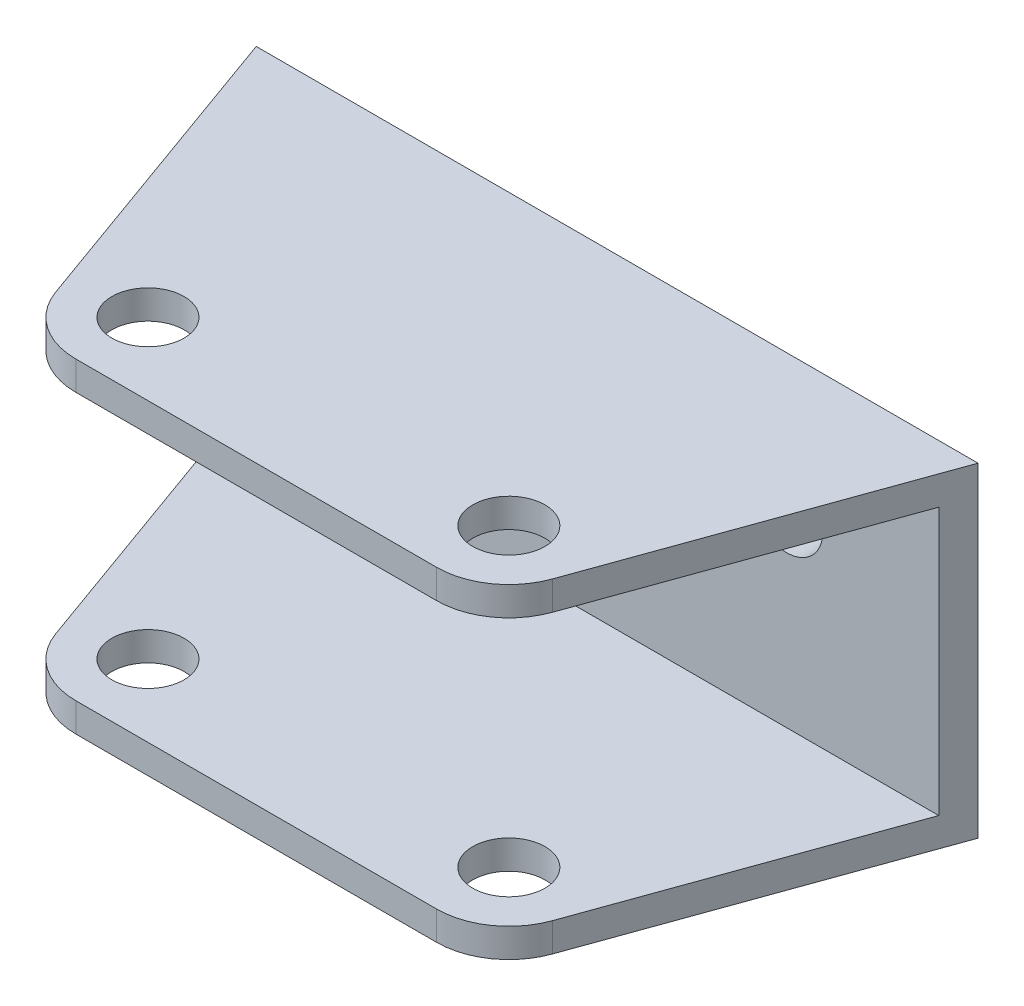
ISO-10303-21;
HEADER;
FILE_DESCRIPTION(('STEP AP214'),'2;1');
FILE_NAME('part.step','',(''),(''),'','','');
FILE_SCHEMA(('AUTOMOTIVE_DESIGN { 1 0 10303 214 1 1 1 1 }'));
ENDSEC;
DATA;
#1=APPLICATION_CONTEXT('core data for automotive mechanical design processes');
#2=APPLICATION_PROTOCOL_DEFINITION('international standard','automotive_design',2000,#1);
#3=PRODUCT_CONTEXT('',#1,'mechanical');
#4=PRODUCT('Part','Part','',(#3));
#5=PRODUCT_RELATED_PRODUCT_CATEGORY('part','',(#4));
#6=PRODUCT_DEFINITION_FORMATION('','',#4);
#7=PRODUCT_DEFINITION_CONTEXT('part definition',#1,'design');
#8=PRODUCT_DEFINITION('design','',#6,#7);
#9=PRODUCT_DEFINITION_SHAPE('','',#8);
#10=(LENGTH_UNIT() NAMED_UNIT(*) SI_UNIT(.MILLI.,.METRE.));
#11=(NAMED_UNIT(*) PLANE_ANGLE_UNIT() SI_UNIT($,.RADIAN.));
#12=(NAMED_UNIT(*) SI_UNIT($,.STERADIAN.) SOLID_ANGLE_UNIT());
#13=UNCERTAINTY_MEASURE_WITH_UNIT(LENGTH_MEASURE(1.E-05),#10,'distance_accuracy_value','');
#14=(GEOMETRIC_REPRESENTATION_CONTEXT(3) GLOBAL_UNCERTAINTY_ASSIGNED_CONTEXT((#13)) GLOBAL_UNIT_ASSIGNED_CONTEXT((#10,
#11,#12)) REPRESENTATION_CONTEXT('',''));
#15=CARTESIAN_POINT('',(0.,0.,0.));
#16=DIRECTION('',(0.,0.,1.));
#17=DIRECTION('',(1.,0.,0.));
#18=AXIS2_PLACEMENT_3D('',#15,#16,#17);
#19=CARTESIAN_POINT('',(0.,0.,82.9));
#20=DIRECTION('',(0.,0.,-1.));
#21=DIRECTION('',(-1.,0.,0.));
#22=AXIS2_PLACEMENT_3D('',#19,#20,#21);
#23=PLANE('',#22);
#24=DIRECTION('',(0.,-1.,0.));
#25=VECTOR('',#24,1.);
#26=CARTESIAN_POINT('',(-35.,-99.29987629617,82.9));
#27=LINE('',#26,#25);
#28=CARTESIAN_POINT('',(-35.,-99.29987629617,82.9));
#29=VERTEX_POINT('',#28);
#30=CARTESIAN_POINT('',(-35.,-103.29987629617,82.9));
#31=VERTEX_POINT('',#30);
#32=EDGE_CURVE('E234',#29,#31,#27,.T.);
#33=ORIENTED_EDGE('',*,*,#32,.T.);
#34=DIRECTION('',(1.,0.,0.));
#35=VECTOR('',#34,1.);
#36=CARTESIAN_POINT('',(0.,-103.29987629617,82.9));
#37=LINE('',#36,#35);
#38=CARTESIAN_POINT('',(15.,-103.29987629617,82.9));
#39=VERTEX_POINT('',#38);
#40=EDGE_CURVE('E196',#31,#39,#37,.T.);
#41=ORIENTED_EDGE('',*,*,#40,.T.);
#42=DIRECTION('',(0.,-1.,0.));
#43=VECTOR('',#42,1.);
#44=CARTESIAN_POINT('',(15.,-99.29987629617,82.9));
#45=LINE('',#44,#43);
#46=CARTESIAN_POINT('',(15.,-99.29987629617,82.9));
#47=VERTEX_POINT('',#46);
#48=EDGE_CURVE('E253',#47,#39,#45,.T.);
#49=ORIENTED_EDGE('',*,*,#48,.F.);
#50=DIRECTION('',(-1.,0.,0.));
#51=VECTOR('',#50,1.);
#52=CARTESIAN_POINT('',(-40.,-99.29987629617,82.9));
#53=LINE('',#52,#51);
#54=EDGE_CURVE('E266',#47,#29,#53,.T.);
#55=ORIENTED_EDGE('',*,*,#54,.T.);
#56=EDGE_LOOP('',(#33,#41,#49,#55));
#57=FACE_BOUND('',#56,.T.);
#58=ADVANCED_FACE('F66',(#57),#23,.F.);
#59=CARTESIAN_POINT('',(15.,-99.29987629617,72.9));
#60=DIRECTION('',(0.,-1.,0.));
#61=DIRECTION('',(0.,0.,-1.));
#62=AXIS2_PLACEMENT_3D('',#59,#60,#61);
#63=CYLINDRICAL_SURFACE('',#62,9.99999999999999);
#64=CARTESIAN_POINT('',(15.,-103.29987629617,72.9));
#65=DIRECTION('',(0.,1.,0.));
#66=DIRECTION('',(0.,0.,1.));
#67=AXIS2_PLACEMENT_3D('',#64,#65,#66);
#68=CIRCLE('',#67,9.99999999999999);
#69=CARTESIAN_POINT('',(24.4108264784655,-103.29987629617,76.281766549041));
#70=VERTEX_POINT('',#69);
#71=EDGE_CURVE('E199',#70,#39,#68,.F.);
#72=ORIENTED_EDGE('',*,*,#71,.F.);
#73=DIRECTION('',(0.,-1.,0.));
#74=VECTOR('',#73,1.);
#75=CARTESIAN_POINT('',(24.4108264784655,-99.29987629617,76.281766549041));
#76=LINE('',#75,#74);
#77=CARTESIAN_POINT('',(24.4108264784655,-99.29987629617,76.281766549041));
#78=VERTEX_POINT('',#77);
#79=EDGE_CURVE('E258',#78,#70,#76,.T.);
#80=ORIENTED_EDGE('',*,*,#79,.F.);
#81=CARTESIAN_POINT('',(15.,-99.29987629617,72.9));
#82=DIRECTION('',(0.,-1.,0.));
#83=DIRECTION('',(0.,0.,-1.));
#84=AXIS2_PLACEMENT_3D('',#81,#82,#83);
#85=CIRCLE('',#84,9.99999999999999);
#86=EDGE_CURVE('E243',#78,#47,#85,.T.);
#87=ORIENTED_EDGE('',*,*,#86,.T.);
#88=ORIENTED_EDGE('',*,*,#48,.T.);
#89=EDGE_LOOP('',(#72,#80,#87,#88));
#90=FACE_BOUND('',#89,.T.);
#91=ADVANCED_FACE('F314',(#90),#63,.T.);
#92=CARTESIAN_POINT('',(15.,-99.29987629617,72.9));
#93=DIRECTION('',(0.,-1.,0.));
#94=DIRECTION('',(0.,0.,-1.));
#95=AXIS2_PLACEMENT_3D('',#92,#93,#94);
#96=CYLINDRICAL_SURFACE('',#95,5.00000000000001);
#97=CARTESIAN_POINT('',(15.,-103.29987629617,72.9));
#98=DIRECTION('',(0.,1.,0.));
#99=DIRECTION('',(0.,0.,1.));
#100=AXIS2_PLACEMENT_3D('',#97,#98,#99);
#101=CIRCLE('',#100,5.00000000000001);
#102=CARTESIAN_POINT('',(15.,-103.29987629617,67.9));
#103=VERTEX_POINT('',#102);
#104=EDGE_CURVE('E205',#103,#103,#101,.F.);
#105=CARTESIAN_POINT('',(15.,-99.29987629617,72.9));
#106=DIRECTION('',(0.,-1.,0.));
#107=DIRECTION('',(0.,0.,-1.));
#108=AXIS2_PLACEMENT_3D('',#105,#106,#107);
#109=CIRCLE('',#108,5.00000000000001);
#110=CARTESIAN_POINT('',(15.,-99.29987629617,67.9));
#111=VERTEX_POINT('',#110);
#112=EDGE_CURVE('E227',#111,#111,#109,.T.);
#113=CARTESIAN_POINT('',(15.,-103.29987629617,67.9));
#114=CARTESIAN_POINT('',(15.,-103.258209629503,67.9));
#115=CARTESIAN_POINT('',(15.,-103.216542962837,67.9));
#116=CARTESIAN_POINT('',(15.,-103.133209629503,67.9));
#117=CARTESIAN_POINT('',(15.,-103.091542962837,67.9));
#118=CARTESIAN_POINT('',(15.,-103.008209629503,67.9));
#119=CARTESIAN_POINT('',(15.,-102.966542962837,67.9));
#120=CARTESIAN_POINT('',(15.,-102.883209629503,67.9));
#121=CARTESIAN_POINT('',(15.,-102.841542962837,67.9));
#122=CARTESIAN_POINT('',(15.,-102.758209629503,67.9));
#123=CARTESIAN_POINT('',(15.,-102.716542962837,67.9));
#124=CARTESIAN_POINT('',(15.,-102.633209629503,67.9));
#125=CARTESIAN_POINT('',(15.,-102.591542962837,67.9));
#126=CARTESIAN_POINT('',(15.,-102.508209629503,67.9));
#127=CARTESIAN_POINT('',(15.,-102.466542962837,67.9));
#128=CARTESIAN_POINT('',(15.,-102.383209629503,67.9));
#129=CARTESIAN_POINT('',(15.,-102.341542962837,67.9));
#130=CARTESIAN_POINT('',(15.,-102.258209629503,67.9));
#131=CARTESIAN_POINT('',(15.,-102.216542962837,67.9));
#132=CARTESIAN_POINT('',(15.,-102.133209629503,67.9));
#133=CARTESIAN_POINT('',(15.,-102.091542962837,67.9));
#134=CARTESIAN_POINT('',(15.,-102.008209629503,67.9));
#135=CARTESIAN_POINT('',(15.,-101.966542962837,67.9));
#136=CARTESIAN_POINT('',(15.,-101.883209629503,67.9));
#137=CARTESIAN_POINT('',(15.,-101.841542962837,67.9));
#138=CARTESIAN_POINT('',(15.,-101.758209629503,67.9));
#139=CARTESIAN_POINT('',(15.,-101.716542962837,67.9));
#140=CARTESIAN_POINT('',(15.,-101.633209629503,67.9));
#141=CARTESIAN_POINT('',(15.,-101.591542962837,67.9));
#142=CARTESIAN_POINT('',(15.,-101.508209629503,67.9));
#143=CARTESIAN_POINT('',(15.,-101.466542962837,67.9));
#144=CARTESIAN_POINT('',(15.,-101.383209629503,67.9));
#145=CARTESIAN_POINT('',(15.,-101.341542962837,67.9));
#146=CARTESIAN_POINT('',(15.,-101.258209629503,67.9));
#147=CARTESIAN_POINT('',(15.,-101.216542962837,67.9));
#148=CARTESIAN_POINT('',(15.,-101.133209629503,67.9));
#149=CARTESIAN_POINT('',(15.,-101.091542962837,67.9));
#150=CARTESIAN_POINT('',(15.,-101.008209629503,67.9));
#151=CARTESIAN_POINT('',(15.,-100.966542962837,67.9));
#152=CARTESIAN_POINT('',(15.,-100.883209629503,67.9));
#153=CARTESIAN_POINT('',(15.,-100.841542962837,67.9));
#154=CARTESIAN_POINT('',(15.,-100.758209629503,67.9));
#155=CARTESIAN_POINT('',(15.,-100.716542962837,67.9));
#156=CARTESIAN_POINT('',(15.,-100.633209629503,67.9));
#157=CARTESIAN_POINT('',(15.,-100.591542962837,67.9));
#158=CARTESIAN_POINT('',(15.,-100.508209629503,67.9));
#159=CARTESIAN_POINT('',(15.,-100.466542962837,67.9));
#160=CARTESIAN_POINT('',(15.,-100.383209629503,67.9));
#161=CARTESIAN_POINT('',(15.,-100.341542962837,67.9));
#162=CARTESIAN_POINT('',(15.,-100.258209629503,67.9));
#163=CARTESIAN_POINT('',(15.,-100.216542962837,67.9));
#164=CARTESIAN_POINT('',(15.,-100.133209629503,67.9));
#165=CARTESIAN_POINT('',(15.,-100.091542962837,67.9));
#166=CARTESIAN_POINT('',(15.,-100.008209629503,67.9));
#167=CARTESIAN_POINT('',(15.,-99.9665429628366,67.9));
#168=CARTESIAN_POINT('',(15.,-99.8832096295033,67.9));
#169=CARTESIAN_POINT('',(15.,-99.8415429628366,67.9));
#170=CARTESIAN_POINT('',(15.,-99.7582096295033,67.9));
#171=CARTESIAN_POINT('',(15.,-99.7165429628366,67.9));
#172=CARTESIAN_POINT('',(15.,-99.6332096295033,67.9));
#173=CARTESIAN_POINT('',(15.,-99.5915429628366,67.9));
#174=CARTESIAN_POINT('',(15.,-99.5082096295033,67.9));
#175=CARTESIAN_POINT('',(15.,-99.4665429628366,67.9));
#176=CARTESIAN_POINT('',(15.,-99.3832096295033,67.9));
#177=CARTESIAN_POINT('',(15.,-99.3415429628366,67.9));
#178=CARTESIAN_POINT('',(15.,-99.29987629617,67.9));
#179=B_SPLINE_CURVE_WITH_KNOTS('',3,(#113,#114,#115,#116,#117,#118,#119,#120,#121,#122,#123,
#124,#125,#126,#127,#128,#129,#130,#131,#132,#133,#134,#135,#136,#137,#138,#139,#140,#141,#142,
#143,#144,#145,#146,#147,#148,#149,#150,#151,#152,#153,#154,#155,#156,#157,#158,#159,#160,#161,
#162,#163,#164,#165,#166,#167,#168,#169,#170,#171,#172,#173,#174,#175,#176,#177,#178),
.UNSPECIFIED.,.F.,.F.,(4,2,2,2,2,2,2,2,2,2,2,2,2,2,2,2,2,2,2,2,2,2,2,2,2,2,2,2,2,2,2,2,4),(0.,
0.125,0.250000000000014,0.375000000000014,0.500000000000014,0.625000000000014,0.750000000000015,
0.875000000000015,1.00000000000001,1.12500000000001,1.25000000000002,1.37500000000002,
1.50000000000002,1.62500000000002,1.75000000000002,1.87500000000002,2.00000000000002,
2.12500000000003,2.25000000000003,2.37500000000003,2.50000000000003,2.62500000000003,
2.75000000000003,2.87500000000003,3.00000000000003,3.12500000000003,3.25000000000003,
3.37500000000003,3.50000000000003,3.62500000000003,3.75000000000003,3.87500000000003,
4.00000000000003),.UNSPECIFIED.);
#180=EDGE_CURVE('BSEAM321',#103,#111,#179,.T.);
#181=ORIENTED_EDGE('',*,*,#104,.T.);
#182=ORIENTED_EDGE('',*,*,#112,.F.);
#183=ORIENTED_EDGE('',*,*,#180,.T.);
#184=ORIENTED_EDGE('',*,*,#180,.F.);
#185=EDGE_LOOP('',(#181,#183,#182,#184));
#186=FACE_BOUND('',#185,.T.);
#187=ADVANCED_FACE('F321',(#186),#96,.F.);
#188=CARTESIAN_POINT('',(-35.,-99.29987629617,72.9));
#189=DIRECTION('',(0.,-1.,0.));
#190=DIRECTION('',(0.,0.,-1.));
#191=AXIS2_PLACEMENT_3D('',#188,#189,#190);
#192=CYLINDRICAL_SURFACE('',#191,5.00000000000001);
#193=CARTESIAN_POINT('',(-35.,-103.29987629617,72.9));
#194=DIRECTION('',(0.,1.,0.));
#195=DIRECTION('',(0.,0.,1.));
#196=AXIS2_PLACEMENT_3D('',#193,#194,#195);
#197=CIRCLE('',#196,5.00000000000001);
#198=CARTESIAN_POINT('',(-35.,-103.29987629617,67.9));
#199=VERTEX_POINT('',#198);
#200=EDGE_CURVE('E202',#199,#199,#197,.F.);
#201=CARTESIAN_POINT('',(-35.,-99.29987629617,72.9));
#202=DIRECTION('',(0.,-1.,0.));
#203=DIRECTION('',(0.,0.,-1.));
#204=AXIS2_PLACEMENT_3D('',#201,#202,#203);
#205=CIRCLE('',#204,5.00000000000001);
#206=CARTESIAN_POINT('',(-35.,-99.29987629617,67.9));
#207=VERTEX_POINT('',#206);
#208=EDGE_CURVE('E210',#207,#207,#205,.T.);
#209=CARTESIAN_POINT('',(-35.,-103.29987629617,67.9));
#210=CARTESIAN_POINT('',(-35.,-103.258209629503,67.9));
#211=CARTESIAN_POINT('',(-35.,-103.216542962837,67.9));
#212=CARTESIAN_POINT('',(-35.,-103.133209629503,67.9));
#213=CARTESIAN_POINT('',(-35.,-103.091542962837,67.9));
#214=CARTESIAN_POINT('',(-35.,-103.008209629503,67.9));
#215=CARTESIAN_POINT('',(-35.,-102.966542962837,67.9));
#216=CARTESIAN_POINT('',(-35.,-102.883209629503,67.9));
#217=CARTESIAN_POINT('',(-35.,-102.841542962837,67.9));
#218=CARTESIAN_POINT('',(-35.,-102.758209629503,67.9));
#219=CARTESIAN_POINT('',(-35.,-102.716542962837,67.9));
#220=CARTESIAN_POINT('',(-35.,-102.633209629503,67.9));
#221=CARTESIAN_POINT('',(-35.,-102.591542962837,67.9));
#222=CARTESIAN_POINT('',(-35.,-102.508209629503,67.9));
#223=CARTESIAN_POINT('',(-35.,-102.466542962837,67.9));
#224=CARTESIAN_POINT('',(-35.,-102.383209629503,67.9));
#225=CARTESIAN_POINT('',(-35.,-102.341542962837,67.9));
#226=CARTESIAN_POINT('',(-35.,-102.258209629503,67.9));
#227=CARTESIAN_POINT('',(-35.,-102.216542962837,67.9));
#228=CARTESIAN_POINT('',(-35.,-102.133209629503,67.9));
#229=CARTESIAN_POINT('',(-35.,-102.091542962837,67.9));
#230=CARTESIAN_POINT('',(-35.,-102.008209629503,67.9));
#231=CARTESIAN_POINT('',(-35.,-101.966542962837,67.9));
#232=CARTESIAN_POINT('',(-35.,-101.883209629503,67.9));
#233=CARTESIAN_POINT('',(-35.,-101.841542962837,67.9));
#234=CARTESIAN_POINT('',(-35.,-101.758209629503,67.9));
#235=CARTESIAN_POINT('',(-35.,-101.716542962837,67.9));
#236=CARTESIAN_POINT('',(-35.,-101.633209629503,67.9));
#237=CARTESIAN_POINT('',(-35.,-101.591542962837,67.9));
#238=CARTESIAN_POINT('',(-35.,-101.508209629503,67.9));
#239=CARTESIAN_POINT('',(-35.,-101.466542962837,67.9));
#240=CARTESIAN_POINT('',(-35.,-101.383209629503,67.9));
#241=CARTESIAN_POINT('',(-35.,-101.341542962837,67.9));
#242=CARTESIAN_POINT('',(-35.,-101.258209629503,67.9));
#243=CARTESIAN_POINT('',(-35.,-101.216542962837,67.9));
#244=CARTESIAN_POINT('',(-35.,-101.133209629503,67.9));
#245=CARTESIAN_POINT('',(-35.,-101.091542962837,67.9));
#246=CARTESIAN_POINT('',(-35.,-101.008209629503,67.9));
#247=CARTESIAN_POINT('',(-35.,-100.966542962837,67.9));
#248=CARTESIAN_POINT('',(-35.,-100.883209629503,67.9));
#249=CARTESIAN_POINT('',(-35.,-100.841542962837,67.9));
#250=CARTESIAN_POINT('',(-35.,-100.758209629503,67.9));
#251=CARTESIAN_POINT('',(-35.,-100.716542962837,67.9));
#252=CARTESIAN_POINT('',(-35.,-100.633209629503,67.9));
#253=CARTESIAN_POINT('',(-35.,-100.591542962837,67.9));
#254=CARTESIAN_POINT('',(-35.,-100.508209629503,67.9));
#255=CARTESIAN_POINT('',(-35.,-100.466542962837,67.9));
#256=CARTESIAN_POINT('',(-35.,-100.383209629503,67.9));
#257=CARTESIAN_POINT('',(-35.,-100.341542962837,67.9));
#258=CARTESIAN_POINT('',(-35.,-100.258209629503,67.9));
#259=CARTESIAN_POINT('',(-35.,-100.216542962837,67.9));
#260=CARTESIAN_POINT('',(-35.,-100.133209629503,67.9));
#261=CARTESIAN_POINT('',(-35.,-100.091542962837,67.9));
#262=CARTESIAN_POINT('',(-35.,-100.008209629503,67.9));
#263=CARTESIAN_POINT('',(-35.,-99.9665429628366,67.9));
#264=CARTESIAN_POINT('',(-35.,-99.8832096295033,67.9));
#265=CARTESIAN_POINT('',(-35.,-99.8415429628366,67.9));
#266=CARTESIAN_POINT('',(-35.,-99.7582096295033,67.9));
#267=CARTESIAN_POINT('',(-35.,-99.7165429628366,67.9));
#268=CARTESIAN_POINT('',(-35.,-99.6332096295033,67.9));
#269=CARTESIAN_POINT('',(-35.,-99.5915429628366,67.9));
#270=CARTESIAN_POINT('',(-35.,-99.5082096295033,67.9));
#271=CARTESIAN_POINT('',(-35.,-99.4665429628366,67.9));
#272=CARTESIAN_POINT('',(-35.,-99.3832096295033,67.9));
#273=CARTESIAN_POINT('',(-35.,-99.3415429628366,67.9));
#274=CARTESIAN_POINT('',(-35.,-99.29987629617,67.9));
#275=B_SPLINE_CURVE_WITH_KNOTS('',3,(#209,#210,#211,#212,#213,#214,#215,#216,#217,#218,#219,
#220,#221,#222,#223,#224,#225,#226,#227,#228,#229,#230,#231,#232,#233,#234,#235,#236,#237,#238,
#239,#240,#241,#242,#243,#244,#245,#246,#247,#248,#249,#250,#251,#252,#253,#254,#255,#256,#257,
#258,#259,#260,#261,#262,#263,#264,#265,#266,#267,#268,#269,#270,#271,#272,#273,#274),
.UNSPECIFIED.,.F.,.F.,(4,2,2,2,2,2,2,2,2,2,2,2,2,2,2,2,2,2,2,2,2,2,2,2,2,2,2,2,2,2,2,2,4),(0.,
0.125,0.250000000000014,0.375000000000014,0.500000000000014,0.625000000000014,0.750000000000015,
0.875000000000015,1.00000000000001,1.12500000000001,1.25000000000002,1.37500000000002,
1.50000000000002,1.62500000000002,1.75000000000002,1.87500000000002,2.00000000000002,
2.12500000000003,2.25000000000003,2.37500000000003,2.50000000000003,2.62500000000003,
2.75000000000003,2.87500000000003,3.00000000000003,3.12500000000003,3.25000000000003,
3.37500000000003,3.50000000000003,3.62500000000003,3.75000000000003,3.87500000000003,
4.00000000000003),.UNSPECIFIED.);
#276=EDGE_CURVE('BSEAM336',#199,#207,#275,.T.);
#277=ORIENTED_EDGE('',*,*,#200,.T.);
#278=ORIENTED_EDGE('',*,*,#208,.F.);
#279=ORIENTED_EDGE('',*,*,#276,.T.);
#280=ORIENTED_EDGE('',*,*,#276,.F.);
#281=EDGE_LOOP('',(#277,#279,#278,#280));
#282=FACE_BOUND('',#281,.T.);
#283=ADVANCED_FACE('F336',(#282),#192,.F.);
#284=CARTESIAN_POINT('',(-35.,-99.29987629617,72.9));
#285=DIRECTION('',(0.,-1.,0.));
#286=DIRECTION('',(0.,0.,-1.));
#287=AXIS2_PLACEMENT_3D('',#284,#285,#286);
#288=CYLINDRICAL_SURFACE('',#287,10.);
#289=CARTESIAN_POINT('',(-35.,-103.29987629617,72.9));
#290=DIRECTION('',(0.,1.,0.));
#291=DIRECTION('',(0.,0.,1.));
#292=AXIS2_PLACEMENT_3D('',#289,#290,#291);
#293=CIRCLE('',#292,10.);
#294=CARTESIAN_POINT('',(-44.4108264784655,-103.29987629617,76.2817665490409));
#295=VERTEX_POINT('',#294);
#296=EDGE_CURVE('E194',#31,#295,#293,.F.);
#297=ORIENTED_EDGE('',*,*,#296,.F.);
#298=ORIENTED_EDGE('',*,*,#32,.F.);
#299=CARTESIAN_POINT('',(-35.,-99.29987629617,72.9));
#300=DIRECTION('',(0.,-1.,0.));
#301=DIRECTION('',(0.,0.,-1.));
#302=AXIS2_PLACEMENT_3D('',#299,#300,#301);
#303=CIRCLE('',#302,10.);
#304=CARTESIAN_POINT('',(-44.4108264784655,-99.29987629617,76.2817665490409));
#305=VERTEX_POINT('',#304);
#306=EDGE_CURVE('E217',#29,#305,#303,.T.);
#307=ORIENTED_EDGE('',*,*,#306,.T.);
#308=DIRECTION('',(0.,-1.,0.));
#309=VECTOR('',#308,1.);
#310=CARTESIAN_POINT('',(-44.4108264784655,-99.29987629617,76.2817665490409));
#311=LINE('',#310,#309);
#312=EDGE_CURVE('E229',#305,#295,#311,.T.);
#313=ORIENTED_EDGE('',*,*,#312,.T.);
#314=EDGE_LOOP('',(#297,#298,#307,#313));
#315=FACE_BOUND('',#314,.T.);
#316=ADVANCED_FACE('F328',(#315),#288,.T.);
#317=CARTESIAN_POINT('',(15.,-140.29987629617,82.9));
#318=VERTEX_POINT('',#317);
#319=CARTESIAN_POINT('',(15.,-144.29987629617,82.9));
#320=VERTEX_POINT('',#319);
#321=EDGE_CURVE('E257',#318,#320,#45,.T.);
#322=ORIENTED_EDGE('',*,*,#321,.F.);
#323=DIRECTION('',(-1.,0.,0.));
#324=VECTOR('',#323,1.);
#325=CARTESIAN_POINT('',(0.,-140.29987629617,82.9));
#326=LINE('',#325,#324);
#327=CARTESIAN_POINT('',(-35.,-140.29987629617,82.9));
#328=VERTEX_POINT('',#327);
#329=EDGE_CURVE('E293',#318,#328,#326,.T.);
#330=ORIENTED_EDGE('',*,*,#329,.T.);
#331=CARTESIAN_POINT('',(-35.,-144.29987629617,82.9));
#332=VERTEX_POINT('',#331);
#333=EDGE_CURVE('E223',#328,#332,#27,.T.);
#334=ORIENTED_EDGE('',*,*,#333,.T.);
#335=DIRECTION('',(1.,0.,0.));
#336=VECTOR('',#335,1.);
#337=CARTESIAN_POINT('',(-40.,-144.29987629617,82.9));
#338=LINE('',#337,#336);
#339=EDGE_CURVE('E270',#332,#320,#338,.T.);
#340=ORIENTED_EDGE('',*,*,#339,.T.);
#341=EDGE_LOOP('',(#322,#330,#334,#340));
#342=FACE_BOUND('',#341,.T.);
#343=ADVANCED_FACE('F317',(#342),#23,.F.);
#344=CARTESIAN_POINT('',(-40.,-99.29987629617,82.9));
#345=DIRECTION('',(0.,-1.,0.));
#346=DIRECTION('',(0.,0.,-1.));
#347=AXIS2_PLACEMENT_3D('',#344,#345,#346);
#348=PLANE('',#347);
#349=ORIENTED_EDGE('',*,*,#208,.T.);
#350=EDGE_LOOP('',(#349));
#351=FACE_BOUND('',#350,.T.);
#352=ORIENTED_EDGE('',*,*,#112,.T.);
#353=EDGE_LOOP('',(#352));
#354=FACE_BOUND('',#353,.T.);
#355=ORIENTED_EDGE('',*,*,#306,.F.);
#356=ORIENTED_EDGE('',*,*,#54,.F.);
#357=ORIENTED_EDGE('',*,*,#86,.F.);
#358=DIRECTION('',(-0.338176654904095,0.,0.941082647846552));
#359=VECTOR('',#358,1.);
#360=CARTESIAN_POINT('',(45.8959587855535,-99.29987629617,16.4926447759193));
#361=LINE('',#360,#359);
#362=CARTESIAN_POINT('',(40.,-99.29987629617,32.9));
#363=VERTEX_POINT('',#362);
#364=EDGE_CURVE('E245',#363,#78,#361,.T.);
#365=ORIENTED_EDGE('',*,*,#364,.F.);
#366=DIRECTION('',(-1.,0.,0.));
#367=VECTOR('',#366,1.);
#368=CARTESIAN_POINT('',(-40.,-99.29987629617,32.9));
#369=LINE('',#368,#367);
#370=CARTESIAN_POINT('',(-60.,-99.29987629617,32.9));
#371=VERTEX_POINT('',#370);
#372=EDGE_CURVE('E277',#363,#371,#369,.T.);
#373=ORIENTED_EDGE('',*,*,#372,.T.);
#374=DIRECTION('',(0.338176654904095,0.,0.941082647846552));
#375=VECTOR('',#374,1.);
#376=CARTESIAN_POINT('',(-63.608689787111,-99.29987629617,22.85768841266));
#377=LINE('',#376,#375);
#378=EDGE_CURVE('E219',#371,#305,#377,.T.);
#379=ORIENTED_EDGE('',*,*,#378,.T.);
#380=EDGE_LOOP('',(#355,#356,#357,#365,#373,#379));
#381=FACE_BOUND('',#380,.T.);
#382=ADVANCED_FACE('F68',(#351,#354,#381),#348,.F.);
#383=CARTESIAN_POINT('',(-40.,-144.29987629617,82.9));
#384=DIRECTION('',(0.,1.,0.));
#385=DIRECTION('',(0.,0.,1.));
#386=AXIS2_PLACEMENT_3D('',#383,#384,#385);
#387=PLANE('',#386);
#388=CARTESIAN_POINT('',(-35.,-144.29987629617,72.9));
#389=DIRECTION('',(0.,-1.,0.));
#390=DIRECTION('',(0.,0.,-1.));
#391=AXIS2_PLACEMENT_3D('',#388,#389,#390);
#392=CIRCLE('',#391,5.00000000000001);
#393=CARTESIAN_POINT('',(-35.,-144.29987629617,67.9));
#394=VERTEX_POINT('',#393);
#395=EDGE_CURVE('E209',#394,#394,#392,.T.);
#396=ORIENTED_EDGE('',*,*,#395,.F.);
#397=EDGE_LOOP('',(#396));
#398=FACE_BOUND('',#397,.T.);
#399=CARTESIAN_POINT('',(15.,-144.29987629617,72.9));
#400=DIRECTION('',(0.,-1.,0.));
#401=DIRECTION('',(0.,0.,-1.));
#402=AXIS2_PLACEMENT_3D('',#399,#400,#401);
#403=CIRCLE('',#402,5.00000000000001);
#404=CARTESIAN_POINT('',(15.,-144.29987629617,67.9));
#405=VERTEX_POINT('',#404);
#406=EDGE_CURVE('E214',#405,#405,#403,.T.);
#407=ORIENTED_EDGE('',*,*,#406,.F.);
#408=EDGE_LOOP('',(#407));
#409=FACE_BOUND('',#408,.T.);
#410=CARTESIAN_POINT('',(-35.,-144.29987629617,72.9));
#411=DIRECTION('',(0.,-1.,0.));
#412=DIRECTION('',(0.,0.,-1.));
#413=AXIS2_PLACEMENT_3D('',#410,#411,#412);
#414=CIRCLE('',#413,10.);
#415=CARTESIAN_POINT('',(-44.4108264784655,-144.29987629617,76.2817665490409));
#416=VERTEX_POINT('',#415);
#417=EDGE_CURVE('E224',#332,#416,#414,.T.);
#418=ORIENTED_EDGE('',*,*,#417,.T.);
#419=DIRECTION('',(0.338176654904095,0.,0.941082647846552));
#420=VECTOR('',#419,1.);
#421=CARTESIAN_POINT('',(-63.608689787111,-144.29987629617,22.85768841266));
#422=LINE('',#421,#420);
#423=CARTESIAN_POINT('',(-60.,-144.29987629617,32.9));
#424=VERTEX_POINT('',#423);
#425=EDGE_CURVE('E220',#424,#416,#422,.T.);
#426=ORIENTED_EDGE('',*,*,#425,.F.);
#427=DIRECTION('',(1.,0.,0.));
#428=VECTOR('',#427,1.);
#429=CARTESIAN_POINT('',(-40.,-144.29987629617,32.9));
#430=LINE('',#429,#428);
#431=CARTESIAN_POINT('',(40.,-144.29987629617,32.9));
#432=VERTEX_POINT('',#431);
#433=EDGE_CURVE('E271',#424,#432,#430,.T.);
#434=ORIENTED_EDGE('',*,*,#433,.T.);
#435=DIRECTION('',(-0.338176654904095,0.,0.941082647846552));
#436=VECTOR('',#435,1.);
#437=CARTESIAN_POINT('',(45.8959587855535,-144.29987629617,16.4926447759193));
#438=LINE('',#437,#436);
#439=CARTESIAN_POINT('',(24.4108264784655,-144.29987629617,76.281766549041));
#440=VERTEX_POINT('',#439);
#441=EDGE_CURVE('E246',#432,#440,#438,.T.);
#442=ORIENTED_EDGE('',*,*,#441,.T.);
#443=CARTESIAN_POINT('',(15.,-144.29987629617,72.9));
#444=DIRECTION('',(0.,-1.,0.));
#445=DIRECTION('',(0.,0.,-1.));
#446=AXIS2_PLACEMENT_3D('',#443,#444,#445);
#447=CIRCLE('',#446,9.99999999999999);
#448=EDGE_CURVE('E232',#440,#320,#447,.T.);
#449=ORIENTED_EDGE('',*,*,#448,.T.);
#450=ORIENTED_EDGE('',*,*,#339,.F.);
#451=EDGE_LOOP('',(#418,#426,#434,#442,#449,#450));
#452=FACE_BOUND('',#451,.T.);
#453=ADVANCED_FACE('F334',(#398,#409,#452),#387,.F.);
#454=CARTESIAN_POINT('',(17.5,-114.3,82.9));
#455=DIRECTION('',(0.,0.,-1.));
#456=DIRECTION('',(-1.,0.,0.));
#457=AXIS2_PLACEMENT_3D('',#454,#455,#456);
#458=CYLINDRICAL_SURFACE('',#457,5.00000000000001);
#459=CARTESIAN_POINT('',(17.5,-114.3,36.9));
#460=DIRECTION('',(0.,0.,-1.));
#461=DIRECTION('',(0.,1.,0.));
#462=AXIS2_PLACEMENT_3D('',#459,#460,#461);
#463=CIRCLE('',#462,5.00000000000001);
#464=CARTESIAN_POINT('',(17.5,-109.3,36.9));
#465=VERTEX_POINT('',#464);
#466=EDGE_CURVE('E185',#465,#465,#463,.T.);
#467=ORIENTED_EDGE('',*,*,#466,.F.);
#468=EDGE_LOOP('',(#467));
#469=FACE_BOUND('',#468,.T.);
#470=CARTESIAN_POINT('',(17.5,-114.3,32.9));
#471=DIRECTION('',(0.,0.,1.));
#472=DIRECTION('',(1.,0.,0.));
#473=AXIS2_PLACEMENT_3D('',#470,#471,#472);
#474=CIRCLE('',#473,5.00000000000001);
#475=CARTESIAN_POINT('',(22.5,-114.3,32.9));
#476=VERTEX_POINT('',#475);
#477=EDGE_CURVE('E262',#476,#476,#474,.T.);
#478=ORIENTED_EDGE('',*,*,#477,.F.);
#479=EDGE_LOOP('',(#478));
#480=FACE_BOUND('',#479,.T.);
#481=ADVANCED_FACE('F358',(#469,#480),#458,.F.);
#482=CARTESIAN_POINT('',(0.,0.,32.9));
#483=DIRECTION('',(0.,0.,-1.));
#484=DIRECTION('',(-1.,0.,0.));
#485=AXIS2_PLACEMENT_3D('',#482,#483,#484);
#486=PLANE('',#485);
#487=ORIENTED_EDGE('',*,*,#477,.T.);
#488=EDGE_LOOP('',(#487));
#489=FACE_BOUND('',#488,.T.);
#490=DIRECTION('',(0.,1.,0.));
#491=VECTOR('',#490,1.);
#492=CARTESIAN_POINT('',(40.,-144.29987629617,32.9));
#493=LINE('',#492,#491);
#494=EDGE_CURVE('E265',#432,#363,#493,.T.);
#495=ORIENTED_EDGE('',*,*,#494,.F.);
#496=ORIENTED_EDGE('',*,*,#433,.F.);
#497=DIRECTION('',(0.,-1.,0.));
#498=VECTOR('',#497,1.);
#499=CARTESIAN_POINT('',(-60.,-144.29987629617,32.9));
#500=LINE('',#499,#498);
#501=EDGE_CURVE('E89',#371,#424,#500,.T.);
#502=ORIENTED_EDGE('',*,*,#501,.F.);
#503=ORIENTED_EDGE('',*,*,#372,.F.);
#504=EDGE_LOOP('',(#495,#496,#502,#503));
#505=FACE_BOUND('',#504,.T.);
#506=CARTESIAN_POINT('',(-17.5,-114.3,32.9));
#507=DIRECTION('',(0.,0.,1.));
#508=DIRECTION('',(1.,0.,0.));
#509=AXIS2_PLACEMENT_3D('',#506,#507,#508);
#510=CIRCLE('',#509,5.00000000000001);
#511=CARTESIAN_POINT('',(-12.5,-114.3,32.9));
#512=VERTEX_POINT('',#511);
#513=EDGE_CURVE('E256',#512,#512,#510,.T.);
#514=ORIENTED_EDGE('',*,*,#513,.T.);
#515=EDGE_LOOP('',(#514));
#516=FACE_BOUND('',#515,.T.);
#517=ADVANCED_FACE('F354',(#489,#505,#516),#486,.T.);
#518=CARTESIAN_POINT('',(-17.5,-114.3,82.9));
#519=DIRECTION('',(0.,0.,-1.));
#520=DIRECTION('',(-1.,0.,0.));
#521=AXIS2_PLACEMENT_3D('',#518,#519,#520);
#522=CYLINDRICAL_SURFACE('',#521,5.00000000000001);
#523=CARTESIAN_POINT('',(-17.5,-114.3,36.9));
#524=DIRECTION('',(0.,0.,-1.));
#525=DIRECTION('',(0.,1.,0.));
#526=AXIS2_PLACEMENT_3D('',#523,#524,#525);
#527=CIRCLE('',#526,5.00000000000001);
#528=CARTESIAN_POINT('',(-17.5,-109.3,36.9));
#529=VERTEX_POINT('',#528);
#530=EDGE_CURVE('E178',#529,#529,#527,.T.);
#531=ORIENTED_EDGE('',*,*,#530,.F.);
#532=EDGE_LOOP('',(#531));
#533=FACE_BOUND('',#532,.T.);
#534=ORIENTED_EDGE('',*,*,#513,.F.);
#535=EDGE_LOOP('',(#534));
#536=FACE_BOUND('',#535,.T.);
#537=ADVANCED_FACE('F357',(#533,#536),#522,.F.);
#538=CARTESIAN_POINT('',(15.,-140.29987629617,72.9));
#539=DIRECTION('',(0.,-1.,0.));
#540=DIRECTION('',(0.,0.,-1.));
#541=AXIS2_PLACEMENT_3D('',#538,#539,#540);
#542=CIRCLE('',#541,9.99999999999999);
#543=CARTESIAN_POINT('',(24.4108264784655,-140.29987629617,76.281766549041));
#544=VERTEX_POINT('',#543);
#545=EDGE_CURVE('E158',#318,#544,#542,.F.);
#546=ORIENTED_EDGE('',*,*,#545,.F.);
#547=ORIENTED_EDGE('',*,*,#321,.T.);
#548=ORIENTED_EDGE('',*,*,#448,.F.);
#549=EDGE_CURVE('E248',#544,#440,#76,.T.);
#550=ORIENTED_EDGE('',*,*,#549,.F.);
#551=EDGE_LOOP('',(#546,#547,#548,#550));
#552=FACE_BOUND('',#551,.T.);
#553=ADVANCED_FACE('F324',(#552),#63,.T.);
#554=CARTESIAN_POINT('',(45.8959587855535,-99.29987629617,16.4926447759193));
#555=DIRECTION('',(0.941082647846552,0.,0.338176654904095));
#556=DIRECTION('',(0.338176654904095,0.,-0.941082647846552));
#557=AXIS2_PLACEMENT_3D('',#554,#555,#556);
#558=PLANE('',#557);
#559=DIRECTION('',(-0.338176654904095,0.,0.941082647846552));
#560=VECTOR('',#559,1.);
#561=CARTESIAN_POINT('',(45.8959587855535,-103.29987629617,16.4926447759193));
#562=LINE('',#561,#560);
#563=CARTESIAN_POINT('',(38.5626059276391,-103.29987629617,36.9));
#564=VERTEX_POINT('',#563);
#565=EDGE_CURVE('E176',#564,#70,#562,.T.);
#566=ORIENTED_EDGE('',*,*,#565,.F.);
#567=DIRECTION('',(0.,1.,0.));
#568=VECTOR('',#567,1.);
#569=CARTESIAN_POINT('',(38.5626059276391,-99.29987629617,36.9));
#570=LINE('',#569,#568);
#571=CARTESIAN_POINT('',(38.562605927639,-140.29987629617,36.9));
#572=VERTEX_POINT('',#571);
#573=EDGE_CURVE('E167',#572,#564,#570,.T.);
#574=ORIENTED_EDGE('',*,*,#573,.F.);
#575=DIRECTION('',(0.338176654904095,0.,-0.941082647846552));
#576=VECTOR('',#575,1.);
#577=CARTESIAN_POINT('',(45.8959587855535,-140.29987629617,16.4926447759193));
#578=LINE('',#577,#576);
#579=EDGE_CURVE('E154',#544,#572,#578,.T.);
#580=ORIENTED_EDGE('',*,*,#579,.F.);
#581=ORIENTED_EDGE('',*,*,#549,.T.);
#582=ORIENTED_EDGE('',*,*,#441,.F.);
#583=ORIENTED_EDGE('',*,*,#494,.T.);
#584=ORIENTED_EDGE('',*,*,#364,.T.);
#585=ORIENTED_EDGE('',*,*,#79,.T.);
#586=EDGE_LOOP('',(#566,#574,#580,#581,#582,#583,#584,#585));
#587=FACE_BOUND('',#586,.T.);
#588=ADVANCED_FACE('F174',(#587),#558,.T.);
#589=CARTESIAN_POINT('',(15.,-140.29987629617,72.9));
#590=DIRECTION('',(0.,-1.,0.));
#591=DIRECTION('',(0.,0.,-1.));
#592=AXIS2_PLACEMENT_3D('',#589,#590,#591);
#593=CIRCLE('',#592,5.00000000000001);
#594=CARTESIAN_POINT('',(15.,-140.29987629617,67.9));
#595=VERTEX_POINT('',#594);
#596=EDGE_CURVE('E179',#595,#595,#593,.F.);
#597=CARTESIAN_POINT('',(15.,-140.29987629617,67.9));
#598=CARTESIAN_POINT('',(15.,-140.341542962837,67.9));
#599=CARTESIAN_POINT('',(15.,-140.383209629503,67.9));
#600=CARTESIAN_POINT('',(15.,-140.466542962837,67.9));
#601=CARTESIAN_POINT('',(15.,-140.508209629503,67.9));
#602=CARTESIAN_POINT('',(15.,-140.591542962837,67.9));
#603=CARTESIAN_POINT('',(15.,-140.633209629503,67.9));
#604=CARTESIAN_POINT('',(15.,-140.716542962837,67.9));
#605=CARTESIAN_POINT('',(15.,-140.758209629503,67.9));
#606=CARTESIAN_POINT('',(15.,-140.841542962837,67.9));
#607=CARTESIAN_POINT('',(15.,-140.883209629503,67.9));
#608=CARTESIAN_POINT('',(15.,-140.966542962837,67.9));
#609=CARTESIAN_POINT('',(15.,-141.008209629503,67.9));
#610=CARTESIAN_POINT('',(15.,-141.091542962837,67.9));
#611=CARTESIAN_POINT('',(15.,-141.133209629503,67.9));
#612=CARTESIAN_POINT('',(15.,-141.216542962837,67.9));
#613=CARTESIAN_POINT('',(15.,-141.258209629503,67.9));
#614=CARTESIAN_POINT('',(15.,-141.341542962837,67.9));
#615=CARTESIAN_POINT('',(15.,-141.383209629503,67.9));
#616=CARTESIAN_POINT('',(15.,-141.466542962837,67.9));
#617=CARTESIAN_POINT('',(15.,-141.508209629503,67.9));
#618=CARTESIAN_POINT('',(15.,-141.591542962837,67.9));
#619=CARTESIAN_POINT('',(15.,-141.633209629503,67.9));
#620=CARTESIAN_POINT('',(15.,-141.716542962837,67.9));
#621=CARTESIAN_POINT('',(15.,-141.758209629503,67.9));
#622=CARTESIAN_POINT('',(15.,-141.841542962837,67.9));
#623=CARTESIAN_POINT('',(15.,-141.883209629503,67.9));
#624=CARTESIAN_POINT('',(15.,-141.966542962837,67.9));
#625=CARTESIAN_POINT('',(15.,-142.008209629503,67.9));
#626=CARTESIAN_POINT('',(15.,-142.091542962837,67.9));
#627=CARTESIAN_POINT('',(15.,-142.133209629503,67.9));
#628=CARTESIAN_POINT('',(15.,-142.216542962837,67.9));
#629=CARTESIAN_POINT('',(15.,-142.258209629503,67.9));
#630=CARTESIAN_POINT('',(15.,-142.341542962837,67.9));
#631=CARTESIAN_POINT('',(15.,-142.383209629503,67.9));
#632=CARTESIAN_POINT('',(15.,-142.466542962837,67.9));
#633=CARTESIAN_POINT('',(15.,-142.508209629503,67.9));
#634=CARTESIAN_POINT('',(15.,-142.591542962837,67.9));
#635=CARTESIAN_POINT('',(15.,-142.633209629503,67.9));
#636=CARTESIAN_POINT('',(15.,-142.716542962837,67.9));
#637=CARTESIAN_POINT('',(15.,-142.758209629503,67.9));
#638=CARTESIAN_POINT('',(15.,-142.841542962837,67.9));
#639=CARTESIAN_POINT('',(15.,-142.883209629503,67.9));
#640=CARTESIAN_POINT('',(15.,-142.966542962837,67.9));
#641=CARTESIAN_POINT('',(15.,-143.008209629503,67.9));
#642=CARTESIAN_POINT('',(15.,-143.091542962837,67.9));
#643=CARTESIAN_POINT('',(15.,-143.133209629503,67.9));
#644=CARTESIAN_POINT('',(15.,-143.216542962837,67.9));
#645=CARTESIAN_POINT('',(15.,-143.258209629503,67.9));
#646=CARTESIAN_POINT('',(15.,-143.341542962837,67.9));
#647=CARTESIAN_POINT('',(15.,-143.383209629503,67.9));
#648=CARTESIAN_POINT('',(15.,-143.466542962837,67.9));
#649=CARTESIAN_POINT('',(15.,-143.508209629503,67.9));
#650=CARTESIAN_POINT('',(15.,-143.591542962837,67.9));
#651=CARTESIAN_POINT('',(15.,-143.633209629503,67.9));
#652=CARTESIAN_POINT('',(15.,-143.716542962837,67.9));
#653=CARTESIAN_POINT('',(15.,-143.758209629503,67.9));
#654=CARTESIAN_POINT('',(15.,-143.841542962837,67.9));
#655=CARTESIAN_POINT('',(15.,-143.883209629503,67.9));
#656=CARTESIAN_POINT('',(15.,-143.966542962837,67.9));
#657=CARTESIAN_POINT('',(15.,-144.008209629503,67.9));
#658=CARTESIAN_POINT('',(15.,-144.091542962837,67.9));
#659=CARTESIAN_POINT('',(15.,-144.133209629503,67.9));
#660=CARTESIAN_POINT('',(15.,-144.216542962837,67.9));
#661=CARTESIAN_POINT('',(15.,-144.258209629503,67.9));
#662=CARTESIAN_POINT('',(15.,-144.29987629617,67.9));
#663=B_SPLINE_CURVE_WITH_KNOTS('',3,(#597,#598,#599,#600,#601,#602,#603,#604,#605,#606,#607,
#608,#609,#610,#611,#612,#613,#614,#615,#616,#617,#618,#619,#620,#621,#622,#623,#624,#625,#626,
#627,#628,#629,#630,#631,#632,#633,#634,#635,#636,#637,#638,#639,#640,#641,#642,#643,#644,#645,
#646,#647,#648,#649,#650,#651,#652,#653,#654,#655,#656,#657,#658,#659,#660,#661,#662),
.UNSPECIFIED.,.F.,.F.,(4,2,2,2,2,2,2,2,2,2,2,2,2,2,2,2,2,2,2,2,2,2,2,2,2,2,2,2,2,2,2,2,4),(0.,
0.124999999999986,0.25,0.374999999999986,0.499999999999973,0.624999999999987,0.750000000000001,
0.874999999999987,0.999999999999973,1.12499999999999,1.24999999999997,1.37499999999999,
1.49999999999997,1.62499999999999,1.74999999999997,1.87499999999999,1.99999999999997,
2.12499999999996,2.24999999999997,2.37499999999996,2.49999999999997,2.62499999999996,
2.74999999999997,2.87499999999996,2.99999999999998,3.12499999999996,3.24999999999995,
3.37499999999996,3.49999999999998,3.62499999999996,3.74999999999995,3.87499999999996,
3.99999999999995),.UNSPECIFIED.);
#664=EDGE_CURVE('BSEAM386',#595,#405,#663,.T.);
#665=ORIENTED_EDGE('',*,*,#596,.T.);
#666=ORIENTED_EDGE('',*,*,#406,.T.);
#667=ORIENTED_EDGE('',*,*,#664,.T.);
#668=ORIENTED_EDGE('',*,*,#664,.F.);
#669=EDGE_LOOP('',(#665,#667,#666,#668));
#670=FACE_BOUND('',#669,.T.);
#671=ADVANCED_FACE('F386',(#670),#96,.F.);
#672=CARTESIAN_POINT('',(-35.,-140.29987629617,72.9));
#673=DIRECTION('',(0.,-1.,0.));
#674=DIRECTION('',(0.,0.,-1.));
#675=AXIS2_PLACEMENT_3D('',#672,#673,#674);
#676=CIRCLE('',#675,5.00000000000001);
#677=CARTESIAN_POINT('',(-35.,-140.29987629617,67.9));
#678=VERTEX_POINT('',#677);
#679=EDGE_CURVE('E162',#678,#678,#676,.F.);
#680=CARTESIAN_POINT('',(-35.,-140.29987629617,67.9));
#681=CARTESIAN_POINT('',(-35.,-140.341542962837,67.9));
#682=CARTESIAN_POINT('',(-35.,-140.383209629503,67.9));
#683=CARTESIAN_POINT('',(-35.,-140.466542962837,67.9));
#684=CARTESIAN_POINT('',(-35.,-140.508209629503,67.9));
#685=CARTESIAN_POINT('',(-35.,-140.591542962837,67.9));
#686=CARTESIAN_POINT('',(-35.,-140.633209629503,67.9));
#687=CARTESIAN_POINT('',(-35.,-140.716542962837,67.9));
#688=CARTESIAN_POINT('',(-35.,-140.758209629503,67.9));
#689=CARTESIAN_POINT('',(-35.,-140.841542962837,67.9));
#690=CARTESIAN_POINT('',(-35.,-140.883209629503,67.9));
#691=CARTESIAN_POINT('',(-35.,-140.966542962837,67.9));
#692=CARTESIAN_POINT('',(-35.,-141.008209629503,67.9));
#693=CARTESIAN_POINT('',(-35.,-141.091542962837,67.9));
#694=CARTESIAN_POINT('',(-35.,-141.133209629503,67.9));
#695=CARTESIAN_POINT('',(-35.,-141.216542962837,67.9));
#696=CARTESIAN_POINT('',(-35.,-141.258209629503,67.9));
#697=CARTESIAN_POINT('',(-35.,-141.341542962837,67.9));
#698=CARTESIAN_POINT('',(-35.,-141.383209629503,67.9));
#699=CARTESIAN_POINT('',(-35.,-141.466542962837,67.9));
#700=CARTESIAN_POINT('',(-35.,-141.508209629503,67.9));
#701=CARTESIAN_POINT('',(-35.,-141.591542962837,67.9));
#702=CARTESIAN_POINT('',(-35.,-141.633209629503,67.9));
#703=CARTESIAN_POINT('',(-35.,-141.716542962837,67.9));
#704=CARTESIAN_POINT('',(-35.,-141.758209629503,67.9));
#705=CARTESIAN_POINT('',(-35.,-141.841542962837,67.9));
#706=CARTESIAN_POINT('',(-35.,-141.883209629503,67.9));
#707=CARTESIAN_POINT('',(-35.,-141.966542962837,67.9));
#708=CARTESIAN_POINT('',(-35.,-142.008209629503,67.9));
#709=CARTESIAN_POINT('',(-35.,-142.091542962837,67.9));
#710=CARTESIAN_POINT('',(-35.,-142.133209629503,67.9));
#711=CARTESIAN_POINT('',(-35.,-142.216542962837,67.9));
#712=CARTESIAN_POINT('',(-35.,-142.258209629503,67.9));
#713=CARTESIAN_POINT('',(-35.,-142.341542962837,67.9));
#714=CARTESIAN_POINT('',(-35.,-142.383209629503,67.9));
#715=CARTESIAN_POINT('',(-35.,-142.466542962837,67.9));
#716=CARTESIAN_POINT('',(-35.,-142.508209629503,67.9));
#717=CARTESIAN_POINT('',(-35.,-142.591542962837,67.9));
#718=CARTESIAN_POINT('',(-35.,-142.633209629503,67.9));
#719=CARTESIAN_POINT('',(-35.,-142.716542962837,67.9));
#720=CARTESIAN_POINT('',(-35.,-142.758209629503,67.9));
#721=CARTESIAN_POINT('',(-35.,-142.841542962837,67.9));
#722=CARTESIAN_POINT('',(-35.,-142.883209629503,67.9));
#723=CARTESIAN_POINT('',(-35.,-142.966542962837,67.9));
#724=CARTESIAN_POINT('',(-35.,-143.008209629503,67.9));
#725=CARTESIAN_POINT('',(-35.,-143.091542962837,67.9));
#726=CARTESIAN_POINT('',(-35.,-143.133209629503,67.9));
#727=CARTESIAN_POINT('',(-35.,-143.216542962837,67.9));
#728=CARTESIAN_POINT('',(-35.,-143.258209629503,67.9));
#729=CARTESIAN_POINT('',(-35.,-143.341542962837,67.9));
#730=CARTESIAN_POINT('',(-35.,-143.383209629503,67.9));
#731=CARTESIAN_POINT('',(-35.,-143.466542962837,67.9));
#732=CARTESIAN_POINT('',(-35.,-143.508209629503,67.9));
#733=CARTESIAN_POINT('',(-35.,-143.591542962837,67.9));
#734=CARTESIAN_POINT('',(-35.,-143.633209629503,67.9));
#735=CARTESIAN_POINT('',(-35.,-143.716542962837,67.9));
#736=CARTESIAN_POINT('',(-35.,-143.758209629503,67.9));
#737=CARTESIAN_POINT('',(-35.,-143.841542962837,67.9));
#738=CARTESIAN_POINT('',(-35.,-143.883209629503,67.9));
#739=CARTESIAN_POINT('',(-35.,-143.966542962837,67.9));
#740=CARTESIAN_POINT('',(-35.,-144.008209629503,67.9));
#741=CARTESIAN_POINT('',(-35.,-144.091542962837,67.9));
#742=CARTESIAN_POINT('',(-35.,-144.133209629503,67.9));
#743=CARTESIAN_POINT('',(-35.,-144.216542962837,67.9));
#744=CARTESIAN_POINT('',(-35.,-144.258209629503,67.9));
#745=CARTESIAN_POINT('',(-35.,-144.29987629617,67.9));
#746=B_SPLINE_CURVE_WITH_KNOTS('',3,(#680,#681,#682,#683,#684,#685,#686,#687,#688,#689,#690,
#691,#692,#693,#694,#695,#696,#697,#698,#699,#700,#701,#702,#703,#704,#705,#706,#707,#708,#709,
#710,#711,#712,#713,#714,#715,#716,#717,#718,#719,#720,#721,#722,#723,#724,#725,#726,#727,#728,
#729,#730,#731,#732,#733,#734,#735,#736,#737,#738,#739,#740,#741,#742,#743,#744,#745),
.UNSPECIFIED.,.F.,.F.,(4,2,2,2,2,2,2,2,2,2,2,2,2,2,2,2,2,2,2,2,2,2,2,2,2,2,2,2,2,2,2,2,4),(0.,
0.124999999999986,0.25,0.374999999999986,0.499999999999973,0.624999999999987,0.750000000000001,
0.874999999999987,0.999999999999973,1.12499999999999,1.24999999999997,1.37499999999999,
1.49999999999997,1.62499999999999,1.74999999999997,1.87499999999999,1.99999999999997,
2.12499999999996,2.24999999999997,2.37499999999996,2.49999999999997,2.62499999999996,
2.74999999999997,2.87499999999996,2.99999999999998,3.12499999999996,3.24999999999995,
3.37499999999996,3.49999999999998,3.62499999999996,3.74999999999995,3.87499999999996,
3.99999999999995),.UNSPECIFIED.);
#747=EDGE_CURVE('BSEAM301',#678,#394,#746,.T.);
#748=ORIENTED_EDGE('',*,*,#679,.T.);
#749=ORIENTED_EDGE('',*,*,#395,.T.);
#750=ORIENTED_EDGE('',*,*,#747,.T.);
#751=ORIENTED_EDGE('',*,*,#747,.F.);
#752=EDGE_LOOP('',(#748,#750,#749,#751));
#753=FACE_BOUND('',#752,.T.);
#754=ADVANCED_FACE('F301',(#753),#192,.F.);
#755=CARTESIAN_POINT('',(-35.,-140.29987629617,72.9));
#756=DIRECTION('',(0.,-1.,0.));
#757=DIRECTION('',(0.,0.,-1.));
#758=AXIS2_PLACEMENT_3D('',#755,#756,#757);
#759=CIRCLE('',#758,10.);
#760=CARTESIAN_POINT('',(-44.4108264784655,-140.29987629617,76.2817665490409));
#761=VERTEX_POINT('',#760);
#762=EDGE_CURVE('E287',#761,#328,#759,.F.);
#763=ORIENTED_EDGE('',*,*,#762,.F.);
#764=EDGE_CURVE('E233',#761,#416,#311,.T.);
#765=ORIENTED_EDGE('',*,*,#764,.T.);
#766=ORIENTED_EDGE('',*,*,#417,.F.);
#767=ORIENTED_EDGE('',*,*,#333,.F.);
#768=EDGE_LOOP('',(#763,#765,#766,#767));
#769=FACE_BOUND('',#768,.T.);
#770=ADVANCED_FACE('F291',(#769),#288,.T.);
#771=CARTESIAN_POINT('',(-63.608689787111,-99.29987629617,22.85768841266));
#772=DIRECTION('',(0.941082647846552,0.,-0.338176654904095));
#773=DIRECTION('',(-0.338176654904095,0.,-0.941082647846552));
#774=AXIS2_PLACEMENT_3D('',#771,#772,#773);
#775=PLANE('',#774);
#776=DIRECTION('',(0.,1.,0.));
#777=VECTOR('',#776,1.);
#778=CARTESIAN_POINT('',(-58.562605927639,-99.29987629617,36.9));
#779=LINE('',#778,#777);
#780=CARTESIAN_POINT('',(-58.562605927639,-140.29987629617,36.9));
#781=VERTEX_POINT('',#780);
#782=CARTESIAN_POINT('',(-58.562605927639,-103.29987629617,36.9));
#783=VERTEX_POINT('',#782);
#784=EDGE_CURVE('E74',#781,#783,#779,.T.);
#785=ORIENTED_EDGE('',*,*,#784,.T.);
#786=DIRECTION('',(0.338176654904095,0.,0.941082647846552));
#787=VECTOR('',#786,1.);
#788=CARTESIAN_POINT('',(-63.608689787111,-103.29987629617,22.85768841266));
#789=LINE('',#788,#787);
#790=EDGE_CURVE('E12',#783,#295,#789,.T.);
#791=ORIENTED_EDGE('',*,*,#790,.T.);
#792=ORIENTED_EDGE('',*,*,#312,.F.);
#793=ORIENTED_EDGE('',*,*,#378,.F.);
#794=ORIENTED_EDGE('',*,*,#501,.T.);
#795=ORIENTED_EDGE('',*,*,#425,.T.);
#796=ORIENTED_EDGE('',*,*,#764,.F.);
#797=DIRECTION('',(-0.338176654904095,0.,-0.941082647846552));
#798=VECTOR('',#797,1.);
#799=CARTESIAN_POINT('',(-63.608689787111,-140.29987629617,22.85768841266));
#800=LINE('',#799,#798);
#801=EDGE_CURVE('E275',#761,#781,#800,.T.);
#802=ORIENTED_EDGE('',*,*,#801,.T.);
#803=EDGE_LOOP('',(#785,#791,#792,#793,#794,#795,#796,#802));
#804=FACE_BOUND('',#803,.T.);
#805=ADVANCED_FACE('F283',(#804),#775,.F.);
#806=CARTESIAN_POINT('',(-60.,-103.29987629617,102.586486309704));
#807=DIRECTION('',(0.,1.,0.));
#808=DIRECTION('',(0.,0.,1.));
#809=AXIS2_PLACEMENT_3D('',#806,#807,#808);
#810=PLANE('',#809);
#811=ORIENTED_EDGE('',*,*,#200,.F.);
#812=EDGE_LOOP('',(#811));
#813=FACE_BOUND('',#812,.T.);
#814=ORIENTED_EDGE('',*,*,#565,.T.);
#815=ORIENTED_EDGE('',*,*,#71,.T.);
#816=ORIENTED_EDGE('',*,*,#40,.F.);
#817=ORIENTED_EDGE('',*,*,#296,.T.);
#818=ORIENTED_EDGE('',*,*,#790,.F.);
#819=DIRECTION('',(1.,0.,0.));
#820=VECTOR('',#819,1.);
#821=CARTESIAN_POINT('',(-60.,-103.29987629617,36.9));
#822=LINE('',#821,#820);
#823=EDGE_CURVE('E171',#783,#564,#822,.T.);
#824=ORIENTED_EDGE('',*,*,#823,.T.);
#825=EDGE_LOOP('',(#814,#815,#816,#817,#818,#824));
#826=FACE_BOUND('',#825,.T.);
#827=ORIENTED_EDGE('',*,*,#104,.F.);
#828=EDGE_LOOP('',(#827));
#829=FACE_BOUND('',#828,.T.);
#830=ADVANCED_FACE('F309',(#813,#826,#829),#810,.F.);
#831=CARTESIAN_POINT('',(-60.,-103.29987629617,36.9));
#832=DIRECTION('',(0.,0.,-1.));
#833=DIRECTION('',(0.,1.,0.));
#834=AXIS2_PLACEMENT_3D('',#831,#832,#833);
#835=PLANE('',#834);
#836=ORIENTED_EDGE('',*,*,#466,.T.);
#837=EDGE_LOOP('',(#836));
#838=FACE_BOUND('',#837,.T.);
#839=ORIENTED_EDGE('',*,*,#530,.T.);
#840=EDGE_LOOP('',(#839));
#841=FACE_BOUND('',#840,.T.);
#842=ORIENTED_EDGE('',*,*,#573,.T.);
#843=ORIENTED_EDGE('',*,*,#823,.F.);
#844=ORIENTED_EDGE('',*,*,#784,.F.);
#845=DIRECTION('',(1.,0.,0.));
#846=VECTOR('',#845,1.);
#847=CARTESIAN_POINT('',(-60.,-140.29987629617,36.9));
#848=LINE('',#847,#846);
#849=EDGE_CURVE('E81',#781,#572,#848,.T.);
#850=ORIENTED_EDGE('',*,*,#849,.T.);
#851=EDGE_LOOP('',(#842,#843,#844,#850));
#852=FACE_BOUND('',#851,.T.);
#853=ADVANCED_FACE('F165',(#838,#841,#852),#835,.F.);
#854=CARTESIAN_POINT('',(-60.,-140.29987629617,36.9));
#855=DIRECTION('',(0.,-1.,0.));
#856=DIRECTION('',(0.,0.,-1.));
#857=AXIS2_PLACEMENT_3D('',#854,#855,#856);
#858=PLANE('',#857);
#859=ORIENTED_EDGE('',*,*,#679,.F.);
#860=EDGE_LOOP('',(#859));
#861=FACE_BOUND('',#860,.T.);
#862=ORIENTED_EDGE('',*,*,#579,.T.);
#863=ORIENTED_EDGE('',*,*,#849,.F.);
#864=ORIENTED_EDGE('',*,*,#801,.F.);
#865=ORIENTED_EDGE('',*,*,#762,.T.);
#866=ORIENTED_EDGE('',*,*,#329,.F.);
#867=ORIENTED_EDGE('',*,*,#545,.T.);
#868=EDGE_LOOP('',(#862,#863,#864,#865,#866,#867));
#869=FACE_BOUND('',#868,.T.);
#870=ORIENTED_EDGE('',*,*,#596,.F.);
#871=EDGE_LOOP('',(#870));
#872=FACE_BOUND('',#871,.T.);
#873=ADVANCED_FACE('F155',(#861,#869,#872),#858,.F.);
#874=CLOSED_SHELL('',(#58,#91,#187,#283,#316,#343,#382,#453,#481,#517,#537,#553,#588,#671,#754,
#770,#805,#830,#853,#873));
#875=MANIFOLD_SOLID_BREP('B2',#874);
#876=ADVANCED_BREP_SHAPE_REPRESENTATION('',(#18,#875),#14);
#877=SHAPE_DEFINITION_REPRESENTATION(#9,#876);
ENDSEC;
END-ISO-10303-21;
